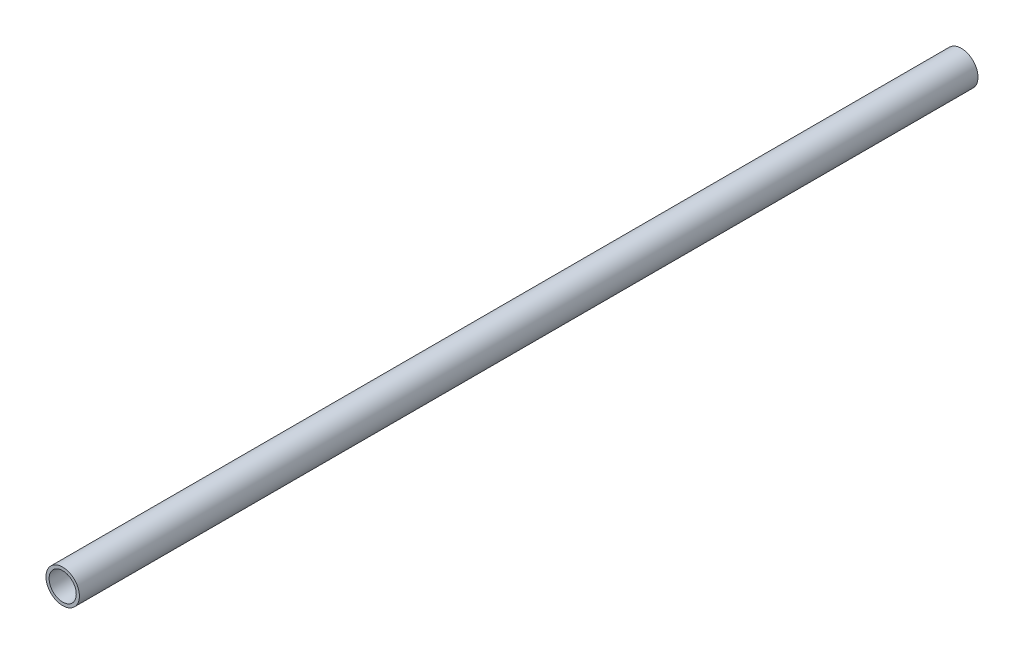
ISO-10303-21;
HEADER;
FILE_DESCRIPTION(('STEP AP214'),'2;1');
FILE_NAME('part.step','',(''),(''),'','','');
FILE_SCHEMA(('AUTOMOTIVE_DESIGN { 1 0 10303 214 1 1 1 1 }'));
ENDSEC;
DATA;
#1=APPLICATION_CONTEXT('core data for automotive mechanical design processes');
#2=APPLICATION_PROTOCOL_DEFINITION('international standard','automotive_design',2000,#1);
#3=PRODUCT_CONTEXT('',#1,'mechanical');
#4=PRODUCT('Part','Part','',(#3));
#5=PRODUCT_RELATED_PRODUCT_CATEGORY('part','',(#4));
#6=PRODUCT_DEFINITION_FORMATION('','',#4);
#7=PRODUCT_DEFINITION_CONTEXT('part definition',#1,'design');
#8=PRODUCT_DEFINITION('design','',#6,#7);
#9=PRODUCT_DEFINITION_SHAPE('','',#8);
#10=(LENGTH_UNIT() NAMED_UNIT(*) SI_UNIT(.MILLI.,.METRE.));
#11=(NAMED_UNIT(*) PLANE_ANGLE_UNIT() SI_UNIT($,.RADIAN.));
#12=(NAMED_UNIT(*) SI_UNIT($,.STERADIAN.) SOLID_ANGLE_UNIT());
#13=UNCERTAINTY_MEASURE_WITH_UNIT(LENGTH_MEASURE(1.E-05),#10,'distance_accuracy_value','');
#14=(GEOMETRIC_REPRESENTATION_CONTEXT(3) GLOBAL_UNCERTAINTY_ASSIGNED_CONTEXT((#13)) GLOBAL_UNIT_ASSIGNED_CONTEXT((#10,
#11,#12)) REPRESENTATION_CONTEXT('',''));
#15=CARTESIAN_POINT('',(0.,0.,0.));
#16=DIRECTION('',(0.,0.,1.));
#17=DIRECTION('',(1.,0.,0.));
#18=AXIS2_PLACEMENT_3D('',#15,#16,#17);
#19=CARTESIAN_POINT('',(0.,0.,430.));
#20=DIRECTION('',(0.,0.,-1.));
#21=DIRECTION('',(-1.,0.,0.));
#22=AXIS2_PLACEMENT_3D('',#19,#20,#21);
#23=CYLINDRICAL_SURFACE('',#22,16.);
#24=CARTESIAN_POINT('',(0.,0.,430.));
#25=DIRECTION('',(0.,0.,1.));
#26=DIRECTION('',(1.,0.,0.));
#27=AXIS2_PLACEMENT_3D('',#24,#25,#26);
#28=CIRCLE('',#27,16.);
#29=CARTESIAN_POINT('',(16.,0.,430.));
#30=VERTEX_POINT('',#29);
#31=EDGE_CURVE('E10',#30,#30,#28,.T.);
#32=ORIENTED_EDGE('',*,*,#31,.F.);
#33=EDGE_LOOP('',(#32));
#34=FACE_BOUND('',#33,.T.);
#35=CARTESIAN_POINT('',(0.,0.,-430.));
#36=DIRECTION('',(0.,0.,1.));
#37=DIRECTION('',(1.,0.,0.));
#38=AXIS2_PLACEMENT_3D('',#35,#36,#37);
#39=CIRCLE('',#38,16.);
#40=CARTESIAN_POINT('',(16.,0.,-430.));
#41=VERTEX_POINT('',#40);
#42=EDGE_CURVE('E35',#41,#41,#39,.T.);
#43=ORIENTED_EDGE('',*,*,#42,.T.);
#44=EDGE_LOOP('',(#43));
#45=FACE_BOUND('',#44,.T.);
#46=ADVANCED_FACE('F32',(#34,#45),#23,.T.);
#47=CARTESIAN_POINT('',(0.,0.,430.));
#48=DIRECTION('',(0.,0.,1.));
#49=DIRECTION('',(1.,0.,0.));
#50=AXIS2_PLACEMENT_3D('',#47,#48,#49);
#51=PLANE('',#50);
#52=CARTESIAN_POINT('',(0.,0.,430.));
#53=DIRECTION('',(0.,0.,1.));
#54=DIRECTION('',(1.,0.,0.));
#55=AXIS2_PLACEMENT_3D('',#52,#53,#54);
#56=CIRCLE('',#55,13.);
#57=CARTESIAN_POINT('',(13.,0.,430.));
#58=VERTEX_POINT('',#57);
#59=EDGE_CURVE('E42',#58,#58,#56,.T.);
#60=ORIENTED_EDGE('',*,*,#59,.F.);
#61=EDGE_LOOP('',(#60));
#62=FACE_BOUND('',#61,.T.);
#63=ORIENTED_EDGE('',*,*,#31,.T.);
#64=EDGE_LOOP('',(#63));
#65=FACE_BOUND('',#64,.T.);
#66=ADVANCED_FACE('F53',(#62,#65),#51,.T.);
#67=CARTESIAN_POINT('',(0.,0.,-430.));
#68=DIRECTION('',(0.,0.,1.));
#69=DIRECTION('',(1.,0.,0.));
#70=AXIS2_PLACEMENT_3D('',#67,#68,#69);
#71=PLANE('',#70);
#72=CARTESIAN_POINT('',(0.,0.,-430.));
#73=DIRECTION('',(0.,0.,1.));
#74=DIRECTION('',(1.,0.,0.));
#75=AXIS2_PLACEMENT_3D('',#72,#73,#74);
#76=CIRCLE('',#75,13.);
#77=CARTESIAN_POINT('',(13.,0.,-430.));
#78=VERTEX_POINT('',#77);
#79=EDGE_CURVE('E44',#78,#78,#76,.T.);
#80=ORIENTED_EDGE('',*,*,#79,.T.);
#81=EDGE_LOOP('',(#80));
#82=FACE_BOUND('',#81,.T.);
#83=ORIENTED_EDGE('',*,*,#42,.F.);
#84=EDGE_LOOP('',(#83));
#85=FACE_BOUND('',#84,.T.);
#86=ADVANCED_FACE('F55',(#82,#85),#71,.F.);
#87=CARTESIAN_POINT('',(0.,0.,430.));
#88=DIRECTION('',(0.,0.,-1.));
#89=DIRECTION('',(-1.,0.,0.));
#90=AXIS2_PLACEMENT_3D('',#87,#88,#89);
#91=CYLINDRICAL_SURFACE('',#90,13.);
#92=ORIENTED_EDGE('',*,*,#59,.T.);
#93=EDGE_LOOP('',(#92));
#94=FACE_BOUND('',#93,.T.);
#95=ORIENTED_EDGE('',*,*,#79,.F.);
#96=EDGE_LOOP('',(#95));
#97=FACE_BOUND('',#96,.T.);
#98=ADVANCED_FACE('F50',(#94,#97),#91,.F.);
#99=CLOSED_SHELL('',(#46,#66,#86,#98));
#100=MANIFOLD_SOLID_BREP('B2',#99);
#101=ADVANCED_BREP_SHAPE_REPRESENTATION('',(#18,#100),#14);
#102=SHAPE_DEFINITION_REPRESENTATION(#9,#101);
ENDSEC;
END-ISO-10303-21;
